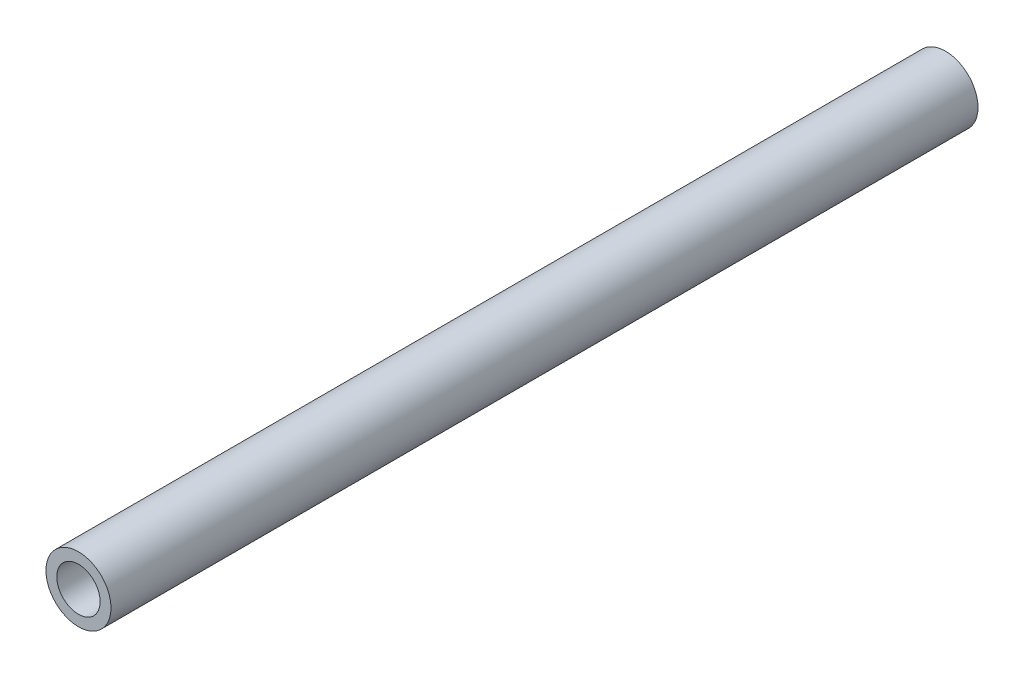
ISO-10303-21;
HEADER;
FILE_DESCRIPTION(('STEP AP214'),'2;1');
FILE_NAME('part.step','',(''),(''),'','','');
FILE_SCHEMA(('AUTOMOTIVE_DESIGN { 1 0 10303 214 1 1 1 1 }'));
ENDSEC;
DATA;
#1=APPLICATION_CONTEXT('core data for automotive mechanical design processes');
#2=APPLICATION_PROTOCOL_DEFINITION('international standard','automotive_design',2000,#1);
#3=PRODUCT_CONTEXT('',#1,'mechanical');
#4=PRODUCT('Part','Part','',(#3));
#5=PRODUCT_RELATED_PRODUCT_CATEGORY('part','',(#4));
#6=PRODUCT_DEFINITION_FORMATION('','',#4);
#7=PRODUCT_DEFINITION_CONTEXT('part definition',#1,'design');
#8=PRODUCT_DEFINITION('design','',#6,#7);
#9=PRODUCT_DEFINITION_SHAPE('','',#8);
#10=(LENGTH_UNIT() NAMED_UNIT(*) SI_UNIT(.MILLI.,.METRE.));
#11=(NAMED_UNIT(*) PLANE_ANGLE_UNIT() SI_UNIT($,.RADIAN.));
#12=(NAMED_UNIT(*) SI_UNIT($,.STERADIAN.) SOLID_ANGLE_UNIT());
#13=UNCERTAINTY_MEASURE_WITH_UNIT(LENGTH_MEASURE(1.E-05),#10,'distance_accuracy_value','');
#14=(GEOMETRIC_REPRESENTATION_CONTEXT(3) GLOBAL_UNCERTAINTY_ASSIGNED_CONTEXT((#13)) GLOBAL_UNIT_ASSIGNED_CONTEXT((#10,
#11,#12)) REPRESENTATION_CONTEXT('',''));
#15=CARTESIAN_POINT('',(0.,0.,0.));
#16=DIRECTION('',(0.,0.,1.));
#17=DIRECTION('',(1.,0.,0.));
#18=AXIS2_PLACEMENT_3D('',#15,#16,#17);
#19=CARTESIAN_POINT('',(0.,0.,80.));
#20=DIRECTION('',(0.,0.,1.));
#21=DIRECTION('',(1.,0.,0.));
#22=AXIS2_PLACEMENT_3D('',#19,#20,#21);
#23=PLANE('',#22);
#24=CARTESIAN_POINT('',(0.,0.,80.));
#25=DIRECTION('',(0.,0.,1.));
#26=DIRECTION('',(1.,0.,0.));
#27=AXIS2_PLACEMENT_3D('',#24,#25,#26);
#28=CIRCLE('',#27,3.);
#29=CARTESIAN_POINT('',(3.,0.,80.));
#30=VERTEX_POINT('',#29);
#31=EDGE_CURVE('E10',#30,#30,#28,.T.);
#32=ORIENTED_EDGE('',*,*,#31,.T.);
#33=EDGE_LOOP('',(#32));
#34=FACE_BOUND('',#33,.T.);
#35=CARTESIAN_POINT('',(0.,0.,80.));
#36=DIRECTION('',(0.,0.,1.));
#37=DIRECTION('',(1.,0.,0.));
#38=AXIS2_PLACEMENT_3D('',#35,#36,#37);
#39=CIRCLE('',#38,2.);
#40=CARTESIAN_POINT('',(2.,0.,80.));
#41=VERTEX_POINT('',#40);
#42=EDGE_CURVE('E54',#41,#41,#39,.T.);
#43=ORIENTED_EDGE('',*,*,#42,.F.);
#44=EDGE_LOOP('',(#43));
#45=FACE_BOUND('',#44,.T.);
#46=ADVANCED_FACE('F41',(#34,#45),#23,.T.);
#47=CARTESIAN_POINT('',(0.,0.,0.));
#48=DIRECTION('',(0.,0.,1.));
#49=DIRECTION('',(1.,0.,0.));
#50=AXIS2_PLACEMENT_3D('',#47,#48,#49);
#51=PLANE('',#50);
#52=CARTESIAN_POINT('',(0.,0.,0.));
#53=DIRECTION('',(0.,0.,1.));
#54=DIRECTION('',(1.,0.,0.));
#55=AXIS2_PLACEMENT_3D('',#52,#53,#54);
#56=CIRCLE('',#55,3.);
#57=CARTESIAN_POINT('',(3.,0.,0.));
#58=VERTEX_POINT('',#57);
#59=EDGE_CURVE('E45',#58,#58,#56,.T.);
#60=ORIENTED_EDGE('',*,*,#59,.F.);
#61=EDGE_LOOP('',(#60));
#62=FACE_BOUND('',#61,.T.);
#63=CARTESIAN_POINT('',(0.,0.,0.));
#64=DIRECTION('',(0.,0.,1.));
#65=DIRECTION('',(1.,0.,0.));
#66=AXIS2_PLACEMENT_3D('',#63,#64,#65);
#67=CIRCLE('',#66,2.);
#68=CARTESIAN_POINT('',(2.,0.,0.));
#69=VERTEX_POINT('',#68);
#70=EDGE_CURVE('E56',#69,#69,#67,.T.);
#71=ORIENTED_EDGE('',*,*,#70,.T.);
#72=EDGE_LOOP('',(#71));
#73=FACE_BOUND('',#72,.T.);
#74=ADVANCED_FACE('F68',(#62,#73),#51,.F.);
#75=CARTESIAN_POINT('',(0.,0.,80.));
#76=DIRECTION('',(0.,0.,-1.));
#77=DIRECTION('',(-1.,0.,0.));
#78=AXIS2_PLACEMENT_3D('',#75,#76,#77);
#79=CYLINDRICAL_SURFACE('',#78,3.);
#80=ORIENTED_EDGE('',*,*,#31,.F.);
#81=EDGE_LOOP('',(#80));
#82=FACE_BOUND('',#81,.T.);
#83=ORIENTED_EDGE('',*,*,#59,.T.);
#84=EDGE_LOOP('',(#83));
#85=FACE_BOUND('',#84,.T.);
#86=ADVANCED_FACE('F43',(#82,#85),#79,.T.);
#87=CARTESIAN_POINT('',(0.,0.,80.));
#88=DIRECTION('',(0.,0.,-1.));
#89=DIRECTION('',(-1.,0.,0.));
#90=AXIS2_PLACEMENT_3D('',#87,#88,#89);
#91=CYLINDRICAL_SURFACE('',#90,2.);
#92=ORIENTED_EDGE('',*,*,#42,.T.);
#93=EDGE_LOOP('',(#92));
#94=FACE_BOUND('',#93,.T.);
#95=ORIENTED_EDGE('',*,*,#70,.F.);
#96=EDGE_LOOP('',(#95));
#97=FACE_BOUND('',#96,.T.);
#98=ADVANCED_FACE('F64',(#94,#97),#91,.F.);
#99=CLOSED_SHELL('',(#46,#74,#86,#98));
#100=MANIFOLD_SOLID_BREP('B2',#99);
#101=ADVANCED_BREP_SHAPE_REPRESENTATION('',(#18,#100),#14);
#102=SHAPE_DEFINITION_REPRESENTATION(#9,#101);
ENDSEC;
END-ISO-10303-21;
